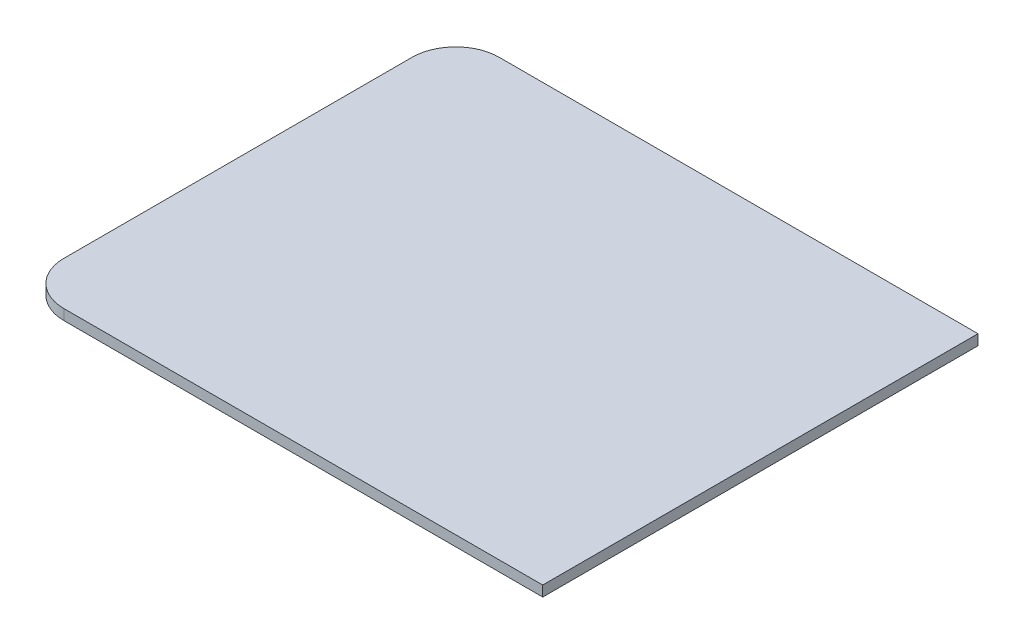
ISO-10303-21;
HEADER;
FILE_DESCRIPTION(('STEP AP214'),'2;1');
FILE_NAME('part.step','',(''),(''),'','','');
FILE_SCHEMA(('AUTOMOTIVE_DESIGN { 1 0 10303 214 1 1 1 1 }'));
ENDSEC;
DATA;
#1=APPLICATION_CONTEXT('core data for automotive mechanical design processes');
#2=APPLICATION_PROTOCOL_DEFINITION('international standard','automotive_design',2000,#1);
#3=PRODUCT_CONTEXT('',#1,'mechanical');
#4=PRODUCT('Part','Part','',(#3));
#5=PRODUCT_RELATED_PRODUCT_CATEGORY('part','',(#4));
#6=PRODUCT_DEFINITION_FORMATION('','',#4);
#7=PRODUCT_DEFINITION_CONTEXT('part definition',#1,'design');
#8=PRODUCT_DEFINITION('design','',#6,#7);
#9=PRODUCT_DEFINITION_SHAPE('','',#8);
#10=(LENGTH_UNIT() NAMED_UNIT(*) SI_UNIT(.MILLI.,.METRE.));
#11=(NAMED_UNIT(*) PLANE_ANGLE_UNIT() SI_UNIT($,.RADIAN.));
#12=(NAMED_UNIT(*) SI_UNIT($,.STERADIAN.) SOLID_ANGLE_UNIT());
#13=UNCERTAINTY_MEASURE_WITH_UNIT(LENGTH_MEASURE(1.E-05),#10,'distance_accuracy_value','');
#14=(GEOMETRIC_REPRESENTATION_CONTEXT(3) GLOBAL_UNCERTAINTY_ASSIGNED_CONTEXT((#13)) GLOBAL_UNIT_ASSIGNED_CONTEXT((#10,
#11,#12)) REPRESENTATION_CONTEXT('',''));
#15=CARTESIAN_POINT('',(0.,0.,0.));
#16=DIRECTION('',(0.,0.,1.));
#17=DIRECTION('',(1.,0.,0.));
#18=AXIS2_PLACEMENT_3D('',#15,#16,#17);
#19=CARTESIAN_POINT('',(-25.,-1.2,-20.));
#20=DIRECTION('',(0.,1.,0.));
#21=DIRECTION('',(0.,0.,1.));
#22=AXIS2_PLACEMENT_3D('',#19,#20,#21);
#23=CYLINDRICAL_SURFACE('',#22,5.);
#24=CARTESIAN_POINT('',(-25.,-1.2,-20.));
#25=DIRECTION('',(0.,-1.,0.));
#26=DIRECTION('',(0.,0.,1.));
#27=AXIS2_PLACEMENT_3D('',#24,#25,#26);
#28=CIRCLE('',#27,5.);
#29=CARTESIAN_POINT('',(-30.,-1.2,-20.));
#30=VERTEX_POINT('',#29);
#31=CARTESIAN_POINT('',(-25.,-1.2,-25.));
#32=VERTEX_POINT('',#31);
#33=EDGE_CURVE('E85',#30,#32,#28,.T.);
#34=ORIENTED_EDGE('',*,*,#33,.F.);
#35=DIRECTION('',(0.,-1.,0.));
#36=VECTOR('',#35,1.);
#37=CARTESIAN_POINT('',(-30.,-1.2,-20.));
#38=LINE('',#37,#36);
#39=CARTESIAN_POINT('',(-30.,0.,-20.));
#40=VERTEX_POINT('',#39);
#41=EDGE_CURVE('E110',#40,#30,#38,.T.);
#42=ORIENTED_EDGE('',*,*,#41,.F.);
#43=CARTESIAN_POINT('',(-25.,0.,-20.));
#44=DIRECTION('',(0.,1.,0.));
#45=DIRECTION('',(0.,0.,1.));
#46=AXIS2_PLACEMENT_3D('',#43,#44,#45);
#47=CIRCLE('',#46,5.);
#48=CARTESIAN_POINT('',(-25.,0.,-25.));
#49=VERTEX_POINT('',#48);
#50=EDGE_CURVE('E11',#49,#40,#47,.T.);
#51=ORIENTED_EDGE('',*,*,#50,.F.);
#52=DIRECTION('',(0.,1.,0.));
#53=VECTOR('',#52,1.);
#54=CARTESIAN_POINT('',(-25.,-1.2,-25.));
#55=LINE('',#54,#53);
#56=EDGE_CURVE('E98',#32,#49,#55,.T.);
#57=ORIENTED_EDGE('',*,*,#56,.F.);
#58=EDGE_LOOP('',(#34,#42,#51,#57));
#59=FACE_BOUND('',#58,.T.);
#60=ADVANCED_FACE('F17',(#59),#23,.T.);
#61=CARTESIAN_POINT('',(-25.,-1.2,20.));
#62=DIRECTION('',(0.,1.,0.));
#63=DIRECTION('',(0.,0.,1.));
#64=AXIS2_PLACEMENT_3D('',#61,#62,#63);
#65=CYLINDRICAL_SURFACE('',#64,5.);
#66=CARTESIAN_POINT('',(-25.,-1.2,20.));
#67=DIRECTION('',(0.,-1.,0.));
#68=DIRECTION('',(0.,0.,1.));
#69=AXIS2_PLACEMENT_3D('',#66,#67,#68);
#70=CIRCLE('',#69,5.);
#71=CARTESIAN_POINT('',(-25.,-1.2,25.));
#72=VERTEX_POINT('',#71);
#73=CARTESIAN_POINT('',(-30.,-1.2,20.));
#74=VERTEX_POINT('',#73);
#75=EDGE_CURVE('E39',#72,#74,#70,.T.);
#76=ORIENTED_EDGE('',*,*,#75,.F.);
#77=DIRECTION('',(0.,-1.,0.));
#78=VECTOR('',#77,1.);
#79=CARTESIAN_POINT('',(-25.,-1.2,25.));
#80=LINE('',#79,#78);
#81=CARTESIAN_POINT('',(-25.,0.,25.));
#82=VERTEX_POINT('',#81);
#83=EDGE_CURVE('E123',#82,#72,#80,.T.);
#84=ORIENTED_EDGE('',*,*,#83,.F.);
#85=CARTESIAN_POINT('',(-25.,0.,20.));
#86=DIRECTION('',(0.,1.,0.));
#87=DIRECTION('',(0.,0.,1.));
#88=AXIS2_PLACEMENT_3D('',#85,#86,#87);
#89=CIRCLE('',#88,5.);
#90=CARTESIAN_POINT('',(-30.,0.,20.));
#91=VERTEX_POINT('',#90);
#92=EDGE_CURVE('E20',#91,#82,#89,.T.);
#93=ORIENTED_EDGE('',*,*,#92,.F.);
#94=DIRECTION('',(0.,1.,0.));
#95=VECTOR('',#94,1.);
#96=CARTESIAN_POINT('',(-30.,-1.2,20.));
#97=LINE('',#96,#95);
#98=EDGE_CURVE('E152',#74,#91,#97,.T.);
#99=ORIENTED_EDGE('',*,*,#98,.F.);
#100=EDGE_LOOP('',(#76,#84,#93,#99));
#101=FACE_BOUND('',#100,.T.);
#102=ADVANCED_FACE('F183',(#101),#65,.T.);
#103=CARTESIAN_POINT('',(0.,0.,0.));
#104=DIRECTION('',(0.,1.,0.));
#105=DIRECTION('',(1.,0.,0.));
#106=AXIS2_PLACEMENT_3D('',#103,#104,#105);
#107=PLANE('',#106);
#108=DIRECTION('',(0.,0.,1.));
#109=VECTOR('',#108,1.);
#110=CARTESIAN_POINT('',(-30.,0.,25.));
#111=LINE('',#110,#109);
#112=EDGE_CURVE('E116',#40,#91,#111,.T.);
#113=ORIENTED_EDGE('',*,*,#112,.T.);
#114=ORIENTED_EDGE('',*,*,#92,.T.);
#115=DIRECTION('',(1.,0.,0.));
#116=VECTOR('',#115,1.);
#117=CARTESIAN_POINT('',(30.,0.,25.));
#118=LINE('',#117,#116);
#119=CARTESIAN_POINT('',(30.,0.,25.));
#120=VERTEX_POINT('',#119);
#121=EDGE_CURVE('E127',#82,#120,#118,.T.);
#122=ORIENTED_EDGE('',*,*,#121,.T.);
#123=DIRECTION('',(0.,0.,-1.));
#124=VECTOR('',#123,1.);
#125=CARTESIAN_POINT('',(30.,0.,25.));
#126=LINE('',#125,#124);
#127=CARTESIAN_POINT('',(30.,0.,-25.));
#128=VERTEX_POINT('',#127);
#129=EDGE_CURVE('E132',#120,#128,#126,.T.);
#130=ORIENTED_EDGE('',*,*,#129,.T.);
#131=DIRECTION('',(-1.,0.,0.));
#132=VECTOR('',#131,1.);
#133=CARTESIAN_POINT('',(30.,0.,-25.));
#134=LINE('',#133,#132);
#135=EDGE_CURVE('E103',#128,#49,#134,.T.);
#136=ORIENTED_EDGE('',*,*,#135,.T.);
#137=ORIENTED_EDGE('',*,*,#50,.T.);
#138=EDGE_LOOP('',(#113,#114,#122,#130,#136,#137));
#139=FACE_BOUND('',#138,.T.);
#140=ADVANCED_FACE('F166',(#139),#107,.T.);
#141=CARTESIAN_POINT('',(0.,-1.2,0.));
#142=DIRECTION('',(0.,1.,0.));
#143=DIRECTION('',(1.,0.,0.));
#144=AXIS2_PLACEMENT_3D('',#141,#142,#143);
#145=PLANE('',#144);
#146=DIRECTION('',(1.,0.,0.));
#147=VECTOR('',#146,1.);
#148=CARTESIAN_POINT('',(30.,-1.2,25.));
#149=LINE('',#148,#147);
#150=CARTESIAN_POINT('',(30.,-1.2,25.));
#151=VERTEX_POINT('',#150);
#152=EDGE_CURVE('E120',#72,#151,#149,.T.);
#153=ORIENTED_EDGE('',*,*,#152,.F.);
#154=ORIENTED_EDGE('',*,*,#75,.T.);
#155=DIRECTION('',(0.,0.,1.));
#156=VECTOR('',#155,1.);
#157=CARTESIAN_POINT('',(-30.,-1.2,25.));
#158=LINE('',#157,#156);
#159=EDGE_CURVE('E92',#30,#74,#158,.T.);
#160=ORIENTED_EDGE('',*,*,#159,.F.);
#161=ORIENTED_EDGE('',*,*,#33,.T.);
#162=DIRECTION('',(-1.,0.,0.));
#163=VECTOR('',#162,1.);
#164=CARTESIAN_POINT('',(30.,-1.2,-25.));
#165=LINE('',#164,#163);
#166=CARTESIAN_POINT('',(30.,-1.2,-25.));
#167=VERTEX_POINT('',#166);
#168=EDGE_CURVE('E90',#167,#32,#165,.T.);
#169=ORIENTED_EDGE('',*,*,#168,.F.);
#170=DIRECTION('',(0.,0.,-1.));
#171=VECTOR('',#170,1.);
#172=CARTESIAN_POINT('',(30.,-1.2,25.));
#173=LINE('',#172,#171);
#174=EDGE_CURVE('E131',#151,#167,#173,.T.);
#175=ORIENTED_EDGE('',*,*,#174,.F.);
#176=EDGE_LOOP('',(#153,#154,#160,#161,#169,#175));
#177=FACE_BOUND('',#176,.T.);
#178=ADVANCED_FACE('F87',(#177),#145,.F.);
#179=CARTESIAN_POINT('',(30.,-1.2,25.));
#180=DIRECTION('',(0.,0.,1.));
#181=DIRECTION('',(1.,0.,0.));
#182=AXIS2_PLACEMENT_3D('',#179,#180,#181);
#183=PLANE('',#182);
#184=ORIENTED_EDGE('',*,*,#121,.F.);
#185=ORIENTED_EDGE('',*,*,#83,.T.);
#186=ORIENTED_EDGE('',*,*,#152,.T.);
#187=DIRECTION('',(0.,1.,0.));
#188=VECTOR('',#187,1.);
#189=CARTESIAN_POINT('',(30.,-1.2,25.));
#190=LINE('',#189,#188);
#191=EDGE_CURVE('E128',#151,#120,#190,.T.);
#192=ORIENTED_EDGE('',*,*,#191,.T.);
#193=EDGE_LOOP('',(#184,#185,#186,#192));
#194=FACE_BOUND('',#193,.T.);
#195=ADVANCED_FACE('F170',(#194),#183,.T.);
#196=CARTESIAN_POINT('',(30.,-1.2,25.));
#197=DIRECTION('',(1.,0.,0.));
#198=DIRECTION('',(0.,1.,0.));
#199=AXIS2_PLACEMENT_3D('',#196,#197,#198);
#200=PLANE('',#199);
#201=ORIENTED_EDGE('',*,*,#129,.F.);
#202=ORIENTED_EDGE('',*,*,#191,.F.);
#203=ORIENTED_EDGE('',*,*,#174,.T.);
#204=DIRECTION('',(0.,1.,0.));
#205=VECTOR('',#204,1.);
#206=CARTESIAN_POINT('',(30.,-1.2,-25.));
#207=LINE('',#206,#205);
#208=EDGE_CURVE('E108',#167,#128,#207,.T.);
#209=ORIENTED_EDGE('',*,*,#208,.T.);
#210=EDGE_LOOP('',(#201,#202,#203,#209));
#211=FACE_BOUND('',#210,.T.);
#212=ADVANCED_FACE('F168',(#211),#200,.T.);
#213=CARTESIAN_POINT('',(30.,-1.2,-25.));
#214=DIRECTION('',(0.,0.,-1.));
#215=DIRECTION('',(-1.,0.,0.));
#216=AXIS2_PLACEMENT_3D('',#213,#214,#215);
#217=PLANE('',#216);
#218=ORIENTED_EDGE('',*,*,#168,.T.);
#219=ORIENTED_EDGE('',*,*,#56,.T.);
#220=ORIENTED_EDGE('',*,*,#135,.F.);
#221=ORIENTED_EDGE('',*,*,#208,.F.);
#222=EDGE_LOOP('',(#218,#219,#220,#221));
#223=FACE_BOUND('',#222,.T.);
#224=ADVANCED_FACE('F106',(#223),#217,.T.);
#225=CARTESIAN_POINT('',(-30.,-1.2,25.));
#226=DIRECTION('',(-1.,0.,0.));
#227=DIRECTION('',(0.,0.,1.));
#228=AXIS2_PLACEMENT_3D('',#225,#226,#227);
#229=PLANE('',#228);
#230=ORIENTED_EDGE('',*,*,#159,.T.);
#231=ORIENTED_EDGE('',*,*,#98,.T.);
#232=ORIENTED_EDGE('',*,*,#112,.F.);
#233=ORIENTED_EDGE('',*,*,#41,.T.);
#234=EDGE_LOOP('',(#230,#231,#232,#233));
#235=FACE_BOUND('',#234,.T.);
#236=ADVANCED_FACE('F164',(#235),#229,.T.);
#237=CLOSED_SHELL('',(#60,#102,#140,#178,#195,#212,#224,#236));
#238=MANIFOLD_SOLID_BREP('B1',#237);
#239=ADVANCED_BREP_SHAPE_REPRESENTATION('',(#18,#238),#14);
#240=SHAPE_DEFINITION_REPRESENTATION(#9,#239);
ENDSEC;
END-ISO-10303-21;
